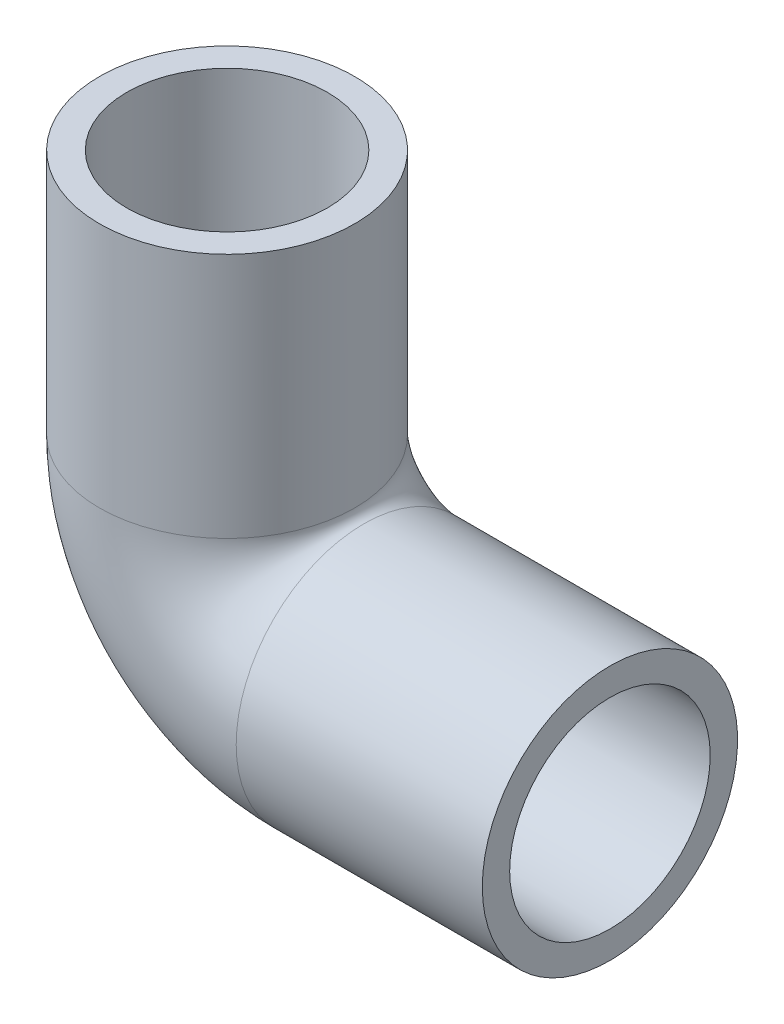
ISO-10303-21;
HEADER;
FILE_DESCRIPTION(('STEP AP214'),'2;1');
FILE_NAME('part.step','',(''),(''),'','','');
FILE_SCHEMA(('AUTOMOTIVE_DESIGN { 1 0 10303 214 1 1 1 1 }'));
ENDSEC;
DATA;
#1=APPLICATION_CONTEXT('core data for automotive mechanical design processes');
#2=APPLICATION_PROTOCOL_DEFINITION('international standard','automotive_design',2000,#1);
#3=PRODUCT_CONTEXT('',#1,'mechanical');
#4=PRODUCT('Part','Part','',(#3));
#5=PRODUCT_RELATED_PRODUCT_CATEGORY('part','',(#4));
#6=PRODUCT_DEFINITION_FORMATION('','',#4);
#7=PRODUCT_DEFINITION_CONTEXT('part definition',#1,'design');
#8=PRODUCT_DEFINITION('design','',#6,#7);
#9=PRODUCT_DEFINITION_SHAPE('','',#8);
#10=(LENGTH_UNIT() NAMED_UNIT(*) SI_UNIT(.MILLI.,.METRE.));
#11=(NAMED_UNIT(*) PLANE_ANGLE_UNIT() SI_UNIT($,.RADIAN.));
#12=(NAMED_UNIT(*) SI_UNIT($,.STERADIAN.) SOLID_ANGLE_UNIT());
#13=UNCERTAINTY_MEASURE_WITH_UNIT(LENGTH_MEASURE(1.E-05),#10,'distance_accuracy_value','');
#14=(GEOMETRIC_REPRESENTATION_CONTEXT(3) GLOBAL_UNCERTAINTY_ASSIGNED_CONTEXT((#13)) GLOBAL_UNIT_ASSIGNED_CONTEXT((#10,
#11,#12)) REPRESENTATION_CONTEXT('',''));
#15=CARTESIAN_POINT('',(0.,0.,0.));
#16=DIRECTION('',(0.,0.,1.));
#17=DIRECTION('',(1.,0.,0.));
#18=AXIS2_PLACEMENT_3D('',#15,#16,#17);
#19=CARTESIAN_POINT('',(0.,42.,0.));
#20=DIRECTION('',(0.,-1.,0.));
#21=DIRECTION('',(1.,0.,0.));
#22=AXIS2_PLACEMENT_3D('',#19,#20,#21);
#23=CYLINDRICAL_SURFACE('',#22,14.);
#24=CARTESIAN_POINT('',(0.,15.,0.));
#25=DIRECTION('',(0.,1.,0.));
#26=DIRECTION('',(0.,0.,1.));
#27=AXIS2_PLACEMENT_3D('',#24,#25,#26);
#28=CIRCLE('',#27,14.);
#29=CARTESIAN_POINT('',(-14.,15.,0.));
#30=VERTEX_POINT('',#29);
#31=EDGE_CURVE('E99',#30,#30,#28,.T.);
#32=ORIENTED_EDGE('',*,*,#31,.T.);
#33=EDGE_LOOP('',(#32));
#34=FACE_BOUND('',#33,.T.);
#35=CARTESIAN_POINT('',(0.,42.,0.));
#36=DIRECTION('',(0.,1.,0.));
#37=DIRECTION('',(0.,0.,1.));
#38=AXIS2_PLACEMENT_3D('',#35,#36,#37);
#39=CIRCLE('',#38,14.);
#40=CARTESIAN_POINT('',(0.,42.,14.));
#41=VERTEX_POINT('',#40);
#42=EDGE_CURVE('E48',#41,#41,#39,.T.);
#43=ORIENTED_EDGE('',*,*,#42,.F.);
#44=EDGE_LOOP('',(#43));
#45=FACE_BOUND('',#44,.T.);
#46=ADVANCED_FACE('F33',(#34,#45),#23,.T.);
#47=CARTESIAN_POINT('',(15.,15.,0.));
#48=DIRECTION('',(0.,0.,1.));
#49=DIRECTION('',(1.,0.,0.));
#50=AXIS2_PLACEMENT_3D('',#47,#48,#49);
#51=TOROIDAL_SURFACE('',#50,15.,14.);
#52=CARTESIAN_POINT('',(15.,0.,0.));
#53=DIRECTION('',(-1.,0.,0.));
#54=DIRECTION('',(0.,0.,1.));
#55=AXIS2_PLACEMENT_3D('',#52,#53,#54);
#56=CIRCLE('',#55,14.);
#57=CARTESIAN_POINT('',(15.,-14.,0.));
#58=VERTEX_POINT('',#57);
#59=EDGE_CURVE('E37',#58,#58,#56,.T.);
#60=CARTESIAN_POINT('',(15.,15.,0.));
#61=DIRECTION('',(0.,0.,1.));
#62=DIRECTION('',(1.,0.,0.));
#63=AXIS2_PLACEMENT_3D('',#60,#61,#62);
#64=CIRCLE('',#63,29.);
#65=EDGE_CURVE('',#30,#58,#64,.T.);
#66=ORIENTED_EDGE('',*,*,#31,.F.);
#67=ORIENTED_EDGE('',*,*,#59,.T.);
#68=ORIENTED_EDGE('',*,*,#65,.T.);
#69=ORIENTED_EDGE('',*,*,#65,.F.);
#70=EDGE_LOOP('',(#66,#68,#67,#69));
#71=FACE_BOUND('',#70,.T.);
#72=ADVANCED_FACE('F106',(#71),#51,.T.);
#73=CARTESIAN_POINT('',(15.,0.,0.));
#74=DIRECTION('',(1.,0.,0.));
#75=DIRECTION('',(0.,1.,0.));
#76=AXIS2_PLACEMENT_3D('',#73,#74,#75);
#77=CYLINDRICAL_SURFACE('',#76,14.);
#78=CARTESIAN_POINT('',(42.,0.,0.));
#79=DIRECTION('',(-1.,0.,0.));
#80=DIRECTION('',(0.,0.,1.));
#81=AXIS2_PLACEMENT_3D('',#78,#79,#80);
#82=CIRCLE('',#81,14.);
#83=CARTESIAN_POINT('',(42.,0.,14.));
#84=VERTEX_POINT('',#83);
#85=EDGE_CURVE('E53',#84,#84,#82,.T.);
#86=ORIENTED_EDGE('',*,*,#85,.T.);
#87=EDGE_LOOP('',(#86));
#88=FACE_BOUND('',#87,.T.);
#89=ORIENTED_EDGE('',*,*,#59,.F.);
#90=EDGE_LOOP('',(#89));
#91=FACE_BOUND('',#90,.T.);
#92=ADVANCED_FACE('F35',(#88,#91),#77,.T.);
#93=CARTESIAN_POINT('',(0.,42.,0.));
#94=DIRECTION('',(0.,1.,0.));
#95=DIRECTION('',(0.,0.,1.));
#96=AXIS2_PLACEMENT_3D('',#93,#94,#95);
#97=PLANE('',#96);
#98=CARTESIAN_POINT('',(0.,42.,0.));
#99=DIRECTION('',(0.,1.,0.));
#100=DIRECTION('',(0.,0.,1.));
#101=AXIS2_PLACEMENT_3D('',#98,#99,#100);
#102=CIRCLE('',#101,11.);
#103=CARTESIAN_POINT('',(0.,42.,11.));
#104=VERTEX_POINT('',#103);
#105=EDGE_CURVE('E92',#104,#104,#102,.F.);
#106=ORIENTED_EDGE('',*,*,#105,.T.);
#107=EDGE_LOOP('',(#106));
#108=FACE_BOUND('',#107,.T.);
#109=ORIENTED_EDGE('',*,*,#42,.T.);
#110=EDGE_LOOP('',(#109));
#111=FACE_BOUND('',#110,.T.);
#112=ADVANCED_FACE('F66',(#108,#111),#97,.T.);
#113=CARTESIAN_POINT('',(42.,0.,0.));
#114=DIRECTION('',(-1.,0.,0.));
#115=DIRECTION('',(0.,0.,1.));
#116=AXIS2_PLACEMENT_3D('',#113,#114,#115);
#117=PLANE('',#116);
#118=CARTESIAN_POINT('',(42.,0.,0.));
#119=DIRECTION('',(-1.,0.,0.));
#120=DIRECTION('',(0.,0.,1.));
#121=AXIS2_PLACEMENT_3D('',#118,#119,#120);
#122=CIRCLE('',#121,11.);
#123=CARTESIAN_POINT('',(42.,0.,11.));
#124=VERTEX_POINT('',#123);
#125=EDGE_CURVE('E11',#124,#124,#122,.F.);
#126=ORIENTED_EDGE('',*,*,#125,.F.);
#127=EDGE_LOOP('',(#126));
#128=FACE_BOUND('',#127,.T.);
#129=ORIENTED_EDGE('',*,*,#85,.F.);
#130=EDGE_LOOP('',(#129));
#131=FACE_BOUND('',#130,.T.);
#132=ADVANCED_FACE('F63',(#128,#131),#117,.F.);
#133=CARTESIAN_POINT('',(0.,42.,0.));
#134=DIRECTION('',(0.,-1.,0.));
#135=DIRECTION('',(1.,0.,0.));
#136=AXIS2_PLACEMENT_3D('',#133,#134,#135);
#137=CYLINDRICAL_SURFACE('',#136,11.);
#138=CARTESIAN_POINT('',(0.,15.,0.));
#139=DIRECTION('',(0.,1.,0.));
#140=DIRECTION('',(0.,0.,1.));
#141=AXIS2_PLACEMENT_3D('',#138,#139,#140);
#142=CIRCLE('',#141,11.);
#143=CARTESIAN_POINT('',(-11.,15.,0.));
#144=VERTEX_POINT('',#143);
#145=EDGE_CURVE('E91',#144,#144,#142,.F.);
#146=ORIENTED_EDGE('',*,*,#145,.T.);
#147=EDGE_LOOP('',(#146));
#148=FACE_BOUND('',#147,.T.);
#149=ORIENTED_EDGE('',*,*,#105,.F.);
#150=EDGE_LOOP('',(#149));
#151=FACE_BOUND('',#150,.T.);
#152=ADVANCED_FACE('F65',(#148,#151),#137,.F.);
#153=CARTESIAN_POINT('',(15.,15.,0.));
#154=DIRECTION('',(0.,0.,1.));
#155=DIRECTION('',(1.,0.,0.));
#156=AXIS2_PLACEMENT_3D('',#153,#154,#155);
#157=TOROIDAL_SURFACE('',#156,15.,11.);
#158=CARTESIAN_POINT('',(15.,0.,0.));
#159=DIRECTION('',(-1.,0.,0.));
#160=DIRECTION('',(0.,0.,1.));
#161=AXIS2_PLACEMENT_3D('',#158,#159,#160);
#162=CIRCLE('',#161,11.);
#163=CARTESIAN_POINT('',(15.,-11.,0.));
#164=VERTEX_POINT('',#163);
#165=EDGE_CURVE('E42',#164,#164,#162,.F.);
#166=CARTESIAN_POINT('',(15.,15.,0.));
#167=DIRECTION('',(0.,0.,1.));
#168=DIRECTION('',(1.,0.,0.));
#169=AXIS2_PLACEMENT_3D('',#166,#167,#168);
#170=CIRCLE('',#169,26.);
#171=EDGE_CURVE('',#144,#164,#170,.T.);
#172=ORIENTED_EDGE('',*,*,#145,.F.);
#173=ORIENTED_EDGE('',*,*,#165,.T.);
#174=ORIENTED_EDGE('',*,*,#171,.T.);
#175=ORIENTED_EDGE('',*,*,#171,.F.);
#176=EDGE_LOOP('',(#172,#174,#173,#175));
#177=FACE_BOUND('',#176,.T.);
#178=ADVANCED_FACE('F72',(#177),#157,.F.);
#179=CARTESIAN_POINT('',(15.,0.,0.));
#180=DIRECTION('',(1.,0.,0.));
#181=DIRECTION('',(0.,1.,0.));
#182=AXIS2_PLACEMENT_3D('',#179,#180,#181);
#183=CYLINDRICAL_SURFACE('',#182,11.);
#184=ORIENTED_EDGE('',*,*,#125,.T.);
#185=EDGE_LOOP('',(#184));
#186=FACE_BOUND('',#185,.T.);
#187=ORIENTED_EDGE('',*,*,#165,.F.);
#188=EDGE_LOOP('',(#187));
#189=FACE_BOUND('',#188,.T.);
#190=ADVANCED_FACE('F60',(#186,#189),#183,.F.);
#191=CLOSED_SHELL('',(#46,#72,#92,#112,#132,#152,#178,#190));
#192=MANIFOLD_SOLID_BREP('B2',#191);
#193=ADVANCED_BREP_SHAPE_REPRESENTATION('',(#18,#192),#14);
#194=SHAPE_DEFINITION_REPRESENTATION(#9,#193);
ENDSEC;
END-ISO-10303-21;
